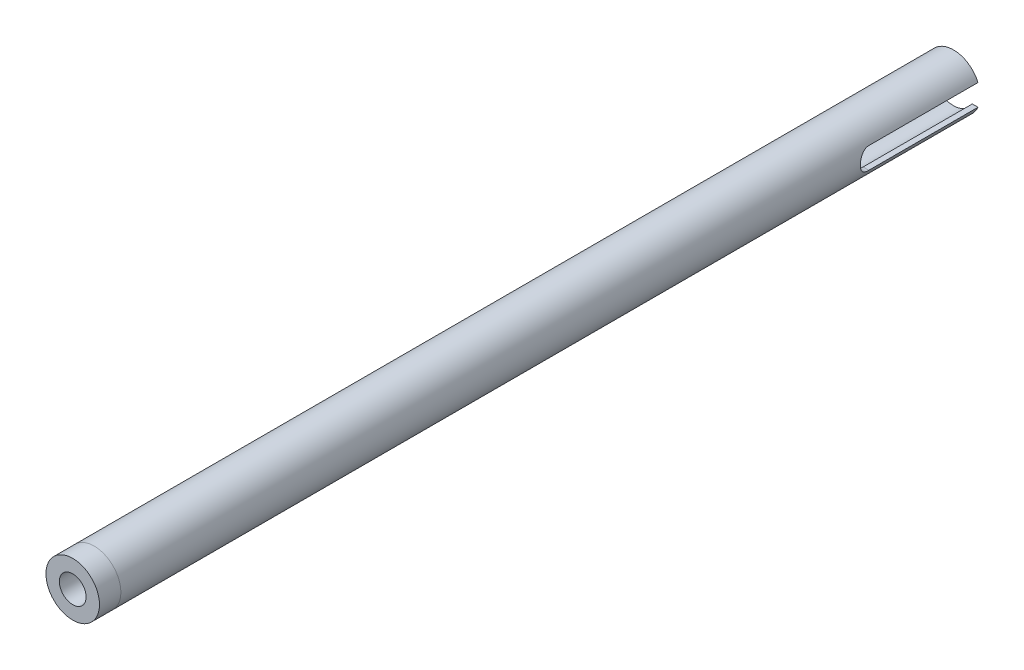
ISO-10303-21;
HEADER;
FILE_DESCRIPTION(('STEP AP214'),'2;1');
FILE_NAME('part.step','',(''),(''),'','','');
FILE_SCHEMA(('AUTOMOTIVE_DESIGN { 1 0 10303 214 1 1 1 1 }'));
ENDSEC;
DATA;
#1=APPLICATION_CONTEXT('core data for automotive mechanical design processes');
#2=APPLICATION_PROTOCOL_DEFINITION('international standard','automotive_design',2000,#1);
#3=PRODUCT_CONTEXT('',#1,'mechanical');
#4=PRODUCT('Part','Part','',(#3));
#5=PRODUCT_RELATED_PRODUCT_CATEGORY('part','',(#4));
#6=PRODUCT_DEFINITION_FORMATION('','',#4);
#7=PRODUCT_DEFINITION_CONTEXT('part definition',#1,'design');
#8=PRODUCT_DEFINITION('design','',#6,#7);
#9=PRODUCT_DEFINITION_SHAPE('','',#8);
#10=(LENGTH_UNIT() NAMED_UNIT(*) SI_UNIT(.MILLI.,.METRE.));
#11=(NAMED_UNIT(*) PLANE_ANGLE_UNIT() SI_UNIT($,.RADIAN.));
#12=(NAMED_UNIT(*) SI_UNIT($,.STERADIAN.) SOLID_ANGLE_UNIT());
#13=UNCERTAINTY_MEASURE_WITH_UNIT(LENGTH_MEASURE(1.E-05),#10,'distance_accuracy_value','');
#14=(GEOMETRIC_REPRESENTATION_CONTEXT(3) GLOBAL_UNCERTAINTY_ASSIGNED_CONTEXT((#13)) GLOBAL_UNIT_ASSIGNED_CONTEXT((#10,
#11,#12)) REPRESENTATION_CONTEXT('',''));
#15=CARTESIAN_POINT('',(0.,0.,0.));
#16=DIRECTION('',(0.,0.,1.));
#17=DIRECTION('',(1.,0.,0.));
#18=AXIS2_PLACEMENT_3D('',#15,#16,#17);
#19=CARTESIAN_POINT('',(0.,0.,-261.290062071358));
#20=DIRECTION('',(0.,0.,1.));
#21=DIRECTION('',(1.,0.,0.));
#22=AXIS2_PLACEMENT_3D('',#19,#20,#21);
#23=CYLINDRICAL_SURFACE('',#22,7.9375);
#24=CARTESIAN_POINT('',(0.,0.,-6.35));
#25=DIRECTION('',(0.,0.,1.));
#26=DIRECTION('',(1.,0.,0.));
#27=AXIS2_PLACEMENT_3D('',#24,#25,#26);
#28=CIRCLE('',#27,7.9375);
#29=CARTESIAN_POINT('',(7.9375,0.,-6.35));
#30=VERTEX_POINT('',#29);
#31=EDGE_CURVE('E167',#30,#30,#28,.T.);
#32=ORIENTED_EDGE('',*,*,#31,.F.);
#33=EDGE_LOOP('',(#32));
#34=FACE_BOUND('',#33,.T.);
#35=CARTESIAN_POINT('',(-7.2748389157424,3.175,-228.905062071358));
#36=CARTESIAN_POINT('',(-7.27482137043434,3.17501267173453,-228.819641955876));
#37=CARTESIAN_POINT('',(-7.27634297592672,3.17155313247793,-228.734231426313));
#38=CARTESIAN_POINT('',(-7.28233338484875,3.15778866907725,-228.564099421985));
#39=CARTESIAN_POINT('',(-7.28680106535325,3.14748635311323,-228.479377697126));
#40=CARTESIAN_POINT('',(-7.29852916312671,3.12019002880163,-228.311563997317));
#41=CARTESIAN_POINT('',(-7.30577831906487,3.10322299732752,-228.228466852558));
#42=CARTESIAN_POINT('',(-7.32282161153745,3.06278779397034,-228.064155750533));
#43=CARTESIAN_POINT('',(-7.33261590324725,3.03931922568673,-227.982941908419));
#44=CARTESIAN_POINT('',(-7.36535331460444,2.9595292434296,-227.743117085837));
#45=CARTESIAN_POINT('',(-7.3916759567784,2.89376893609236,-227.587992157033));
#46=CARTESIAN_POINT('',(-7.45033259991548,2.73920602658921,-227.290904730322));
#47=CARTESIAN_POINT('',(-7.48267254395243,2.65038060922871,-227.148955455104));
#48=CARTESIAN_POINT('',(-7.55175295441386,2.44684429809695,-226.874234685584));
#49=CARTESIAN_POINT('',(-7.58863404630154,2.33103943595689,-226.742307301072));
#50=CARTESIAN_POINT('',(-7.66147718953598,2.07914562663536,-226.49914441744));
#51=CARTESIAN_POINT('',(-7.69743902899202,1.94305205135847,-226.387913652513));
#52=CARTESIAN_POINT('',(-7.76611692840652,1.64778282664418,-226.184992453017));
#53=CARTESIAN_POINT('',(-7.79864638434713,1.48790317306355,-226.094258041614));
#54=CARTESIAN_POINT('',(-7.85502980346525,1.15369615984562,-225.941400488196));
#55=CARTESIAN_POINT('',(-7.87889360585224,0.979385463602713,-225.879244875579));
#56=CARTESIAN_POINT('',(-7.91022225039827,0.670405323433344,-225.798733231923));
#57=CARTESIAN_POINT('',(-7.92038443902171,0.537888188660429,-225.773055308513));
#58=CARTESIAN_POINT('',(-7.93061686811603,0.337231082382099,-225.747300225432));
#59=CARTESIAN_POINT('',(-7.93319257341971,0.269991647180292,-225.740842128151));
#60=CARTESIAN_POINT('',(-7.93663621925193,0.135173873369592,-225.7322211104));
#61=CARTESIAN_POINT('',(-7.93750363389236,0.067595436817584,-225.730059512581));
#62=CARTESIAN_POINT('',(-7.9375,0.,-225.730062071358));
#63=B_SPLINE_CURVE_WITH_KNOTS('',3,(#35,#36,#37,#38,#39,#40,#41,#42,#43,#44,#45,#46,#47,#48,#49,
#50,#51,#52,#53,#54,#55,#56,#57,#58,#59,#60,#61,#62),.UNSPECIFIED.,.F.,.F.,(4,2,2,2,2,2,2,2,2,2,
2,2,2,4),(0.,0.25616079739664,0.512224013007086,0.767261264672294,1.02231406945474,
1.53142416248601,2.041039780479,2.57679273649399,3.11266809162684,3.66991136029743,
4.22651992730647,4.63134321412667,4.83399375866621,5.03670667834028),.UNSPECIFIED.);
#64=CARTESIAN_POINT('',(-7.2748389157424,3.175,-228.905062071358));
#65=VERTEX_POINT('',#64);
#66=CARTESIAN_POINT('',(-7.9375,0.,-225.730062071358));
#67=VERTEX_POINT('',#66);
#68=EDGE_CURVE('E194',#65,#67,#63,.T.);
#69=ORIENTED_EDGE('',*,*,#68,.T.);
#70=CARTESIAN_POINT('',(-7.9375,0.,-225.730062071358));
#71=CARTESIAN_POINT('',(-7.93751279435796,-0.0856973243893168,-225.730050041189));
#72=CARTESIAN_POINT('',(-7.93611246860092,-0.171386675169291,-225.733531408661));
#73=CARTESIAN_POINT('',(-7.93058107051394,-0.342092796869088,-225.747387503996));
#74=CARTESIAN_POINT('',(-7.92645080745519,-0.427109759557718,-225.757760188979));
#75=CARTESIAN_POINT('',(-7.91557399086504,-0.595570690948318,-225.785257383047));
#76=CARTESIAN_POINT('',(-7.90883664469869,-0.679019123580009,-225.80235813432));
#77=CARTESIAN_POINT('',(-7.89293284658536,-0.844038966454647,-225.843125381793));
#78=CARTESIAN_POINT('',(-7.88376629739099,-0.925610301410308,-225.86679214085));
#79=CARTESIAN_POINT('',(-7.8529700783248,-1.16656173687589,-225.947299796548));
#80=CARTESIAN_POINT('',(-7.82802544143957,-1.32244720282991,-226.013692429425));
#81=CARTESIAN_POINT('',(-7.77174407779742,-1.6208190257289,-226.169737833418));
#82=CARTESIAN_POINT('',(-7.74040257287306,-1.76329524966532,-226.259408005482));
#83=CARTESIAN_POINT('',(-7.67287736621953,-2.03755465224645,-226.463861612997));
#84=CARTESIAN_POINT('',(-7.63654472176442,-2.16862853615059,-226.579548469728));
#85=CARTESIAN_POINT('',(-7.56380976030912,-2.41011022612819,-226.830842571437));
#86=CARTESIAN_POINT('',(-7.52740741976911,-2.52050895891189,-226.96645851592));
#87=CARTESIAN_POINT('',(-7.45683282624283,-2.72240939900244,-227.261157010786));
#88=CARTESIAN_POINT('',(-7.42283467350379,-2.81283701743192,-227.421021000702));
#89=CARTESIAN_POINT('',(-7.36333622196319,-2.9651189416839,-227.755146965498));
#90=CARTESIAN_POINT('',(-7.33782422493328,-3.02701262758154,-227.929388703257));
#91=CARTESIAN_POINT('',(-7.30424985403508,-3.10695047193343,-228.237692427908));
#92=CARTESIAN_POINT('',(-7.29331360019112,-3.13238569878911,-228.369551188794));
#93=CARTESIAN_POINT('',(-7.2822797767429,-3.15790858319002,-228.569268070488));
#94=CARTESIAN_POINT('',(-7.27949685702346,-3.16431127275807,-228.636216361248));
#95=CARTESIAN_POINT('',(-7.27577355567174,-3.17285909036155,-228.770457919114));
#96=CARTESIAN_POINT('',(-7.27483380475762,-3.17500276099679,-228.837751296412));
#97=CARTESIAN_POINT('',(-7.2748389157424,-3.175,-228.905062071359));
#98=B_SPLINE_CURVE_WITH_KNOTS('',3,(#70,#71,#72,#73,#74,#75,#76,#77,#78,#79,#80,#81,#82,#83,#84,
#85,#86,#87,#88,#89,#90,#91,#92,#93,#94,#95,#96,#97),.UNSPECIFIED.,.F.,.F.,(4,2,2,2,2,2,2,2,2,2,
2,2,2,4),(0.,0.256996432008008,0.513916713336977,0.769937797705395,1.02596913282158,
1.53722547809955,2.04886511530061,2.58219314099272,3.115754672018,3.67332953074265,
4.23013255190376,4.63306130520187,4.83485003827449,5.03670780985621),.UNSPECIFIED.);
#99=CARTESIAN_POINT('',(-7.2748389157424,-3.175,-228.905062071358));
#100=VERTEX_POINT('',#99);
#101=EDGE_CURVE('E146',#67,#100,#98,.T.);
#102=ORIENTED_EDGE('',*,*,#101,.T.);
#103=DIRECTION('',(0.,0.,-1.));
#104=VECTOR('',#103,1.);
#105=CARTESIAN_POINT('',(-7.2748389157424,-3.175,-225.730062071358));
#106=LINE('',#105,#104);
#107=CARTESIAN_POINT('',(-7.2748389157424,-3.175,-261.290062071358));
#108=VERTEX_POINT('',#107);
#109=EDGE_CURVE('E141',#100,#108,#106,.T.);
#110=ORIENTED_EDGE('',*,*,#109,.T.);
#111=CARTESIAN_POINT('',(0.,0.,-261.290062071358));
#112=DIRECTION('',(0.,0.,1.));
#113=DIRECTION('',(1.,0.,0.));
#114=AXIS2_PLACEMENT_3D('',#111,#112,#113);
#115=CIRCLE('',#114,7.9375);
#116=CARTESIAN_POINT('',(7.2748389157424,-3.175,-261.290062071358));
#117=VERTEX_POINT('',#116);
#118=EDGE_CURVE('E144',#108,#117,#115,.T.);
#119=ORIENTED_EDGE('',*,*,#118,.T.);
#120=DIRECTION('',(0.,0.,-1.));
#121=VECTOR('',#120,1.);
#122=CARTESIAN_POINT('',(7.2748389157424,-3.175,-225.730062071358));
#123=LINE('',#122,#121);
#124=CARTESIAN_POINT('',(7.2748389157424,-3.175,-228.905062071358));
#125=VERTEX_POINT('',#124);
#126=EDGE_CURVE('E427',#125,#117,#123,.T.);
#127=ORIENTED_EDGE('',*,*,#126,.F.);
#128=CARTESIAN_POINT('',(7.2748389157424,-3.175,-228.905062071358));
#129=CARTESIAN_POINT('',(7.27482137043434,-3.17501267173453,-228.819641955876));
#130=CARTESIAN_POINT('',(7.27634297592672,-3.17155313247793,-228.734231426313));
#131=CARTESIAN_POINT('',(7.28233338484875,-3.15778866907725,-228.564099421985));
#132=CARTESIAN_POINT('',(7.28680106535325,-3.14748635311323,-228.479377697126));
#133=CARTESIAN_POINT('',(7.29852916312671,-3.12019002880163,-228.311563997317));
#134=CARTESIAN_POINT('',(7.30577831906487,-3.10322299732752,-228.228466852558));
#135=CARTESIAN_POINT('',(7.32282161153745,-3.06278779397034,-228.064155750533));
#136=CARTESIAN_POINT('',(7.33261590324725,-3.03931922568673,-227.982941908419));
#137=CARTESIAN_POINT('',(7.36535331460444,-2.9595292434296,-227.743117085837));
#138=CARTESIAN_POINT('',(7.3916759567784,-2.89376893609236,-227.587992157033));
#139=CARTESIAN_POINT('',(7.45033259991548,-2.73920602658921,-227.290904730322));
#140=CARTESIAN_POINT('',(7.48267254395243,-2.65038060922871,-227.148955455104));
#141=CARTESIAN_POINT('',(7.55175295441386,-2.44684429809695,-226.874234685584));
#142=CARTESIAN_POINT('',(7.58863404630154,-2.33103943595689,-226.742307301072));
#143=CARTESIAN_POINT('',(7.66147718953598,-2.07914562663536,-226.49914441744));
#144=CARTESIAN_POINT('',(7.69743902899202,-1.94305205135847,-226.387913652513));
#145=CARTESIAN_POINT('',(7.76611692840652,-1.64778282664418,-226.184992453017));
#146=CARTESIAN_POINT('',(7.79864638434713,-1.48790317306355,-226.094258041614));
#147=CARTESIAN_POINT('',(7.85502980346525,-1.15369615984562,-225.941400488196));
#148=CARTESIAN_POINT('',(7.87889360585224,-0.979385463602713,-225.879244875579));
#149=CARTESIAN_POINT('',(7.91022225039827,-0.670405323433344,-225.798733231923));
#150=CARTESIAN_POINT('',(7.92038443902171,-0.537888188660429,-225.773055308513));
#151=CARTESIAN_POINT('',(7.93061686811603,-0.337231082382099,-225.747300225432));
#152=CARTESIAN_POINT('',(7.93319257341971,-0.269991647180292,-225.740842128151));
#153=CARTESIAN_POINT('',(7.93663621925193,-0.135173873369592,-225.7322211104));
#154=CARTESIAN_POINT('',(7.93750363389236,-0.067595436817584,-225.730059512581));
#155=CARTESIAN_POINT('',(7.9375,0.,-225.730062071358));
#156=B_SPLINE_CURVE_WITH_KNOTS('',3,(#128,#129,#130,#131,#132,#133,#134,#135,#136,#137,#138,
#139,#140,#141,#142,#143,#144,#145,#146,#147,#148,#149,#150,#151,#152,#153,#154,#155),
.UNSPECIFIED.,.F.,.F.,(4,2,2,2,2,2,2,2,2,2,2,2,2,4),(0.,0.25616079739664,0.512224013007086,
0.767261264672294,1.02231406945474,1.53142416248601,2.041039780479,2.57679273649399,
3.11266809162684,3.66991136029743,4.22651992730647,4.63134321412667,4.83399375866621,
5.03670667834028),.UNSPECIFIED.);
#157=CARTESIAN_POINT('',(7.9375,0.,-225.730062071358));
#158=VERTEX_POINT('',#157);
#159=EDGE_CURVE('E87',#125,#158,#156,.T.);
#160=ORIENTED_EDGE('',*,*,#159,.T.);
#161=CARTESIAN_POINT('',(7.9375,0.,-225.730062071358));
#162=CARTESIAN_POINT('',(7.93751279435796,0.0856973243893168,-225.730050041189));
#163=CARTESIAN_POINT('',(7.93611246860092,0.171386675169291,-225.733531408661));
#164=CARTESIAN_POINT('',(7.93058107051394,0.342092796869088,-225.747387503996));
#165=CARTESIAN_POINT('',(7.92645080745519,0.427109759557718,-225.757760188979));
#166=CARTESIAN_POINT('',(7.91557399086504,0.595570690948318,-225.785257383047));
#167=CARTESIAN_POINT('',(7.90883664469869,0.679019123580009,-225.80235813432));
#168=CARTESIAN_POINT('',(7.89293284658536,0.844038966454647,-225.843125381793));
#169=CARTESIAN_POINT('',(7.88376629739099,0.925610301410308,-225.86679214085));
#170=CARTESIAN_POINT('',(7.8529700783248,1.16656173687589,-225.947299796548));
#171=CARTESIAN_POINT('',(7.82802544143957,1.32244720282991,-226.013692429425));
#172=CARTESIAN_POINT('',(7.77174407779742,1.6208190257289,-226.169737833418));
#173=CARTESIAN_POINT('',(7.74040257287306,1.76329524966532,-226.259408005482));
#174=CARTESIAN_POINT('',(7.67287736621953,2.03755465224645,-226.463861612997));
#175=CARTESIAN_POINT('',(7.63654472176442,2.16862853615059,-226.579548469728));
#176=CARTESIAN_POINT('',(7.56380976030912,2.41011022612819,-226.830842571437));
#177=CARTESIAN_POINT('',(7.52740741976911,2.52050895891189,-226.96645851592));
#178=CARTESIAN_POINT('',(7.45683282624283,2.72240939900244,-227.261157010786));
#179=CARTESIAN_POINT('',(7.42283467350379,2.81283701743192,-227.421021000702));
#180=CARTESIAN_POINT('',(7.36333622196319,2.9651189416839,-227.755146965498));
#181=CARTESIAN_POINT('',(7.33782422493328,3.02701262758154,-227.929388703257));
#182=CARTESIAN_POINT('',(7.30424985403508,3.10695047193343,-228.237692427908));
#183=CARTESIAN_POINT('',(7.29331360019112,3.13238569878911,-228.369551188794));
#184=CARTESIAN_POINT('',(7.2822797767429,3.15790858319002,-228.569268070488));
#185=CARTESIAN_POINT('',(7.27949685702346,3.16431127275807,-228.636216361248));
#186=CARTESIAN_POINT('',(7.27577355567174,3.17285909036155,-228.770457919114));
#187=CARTESIAN_POINT('',(7.27483380475762,3.17500276099679,-228.837751296412));
#188=CARTESIAN_POINT('',(7.2748389157424,3.175,-228.905062071359));
#189=B_SPLINE_CURVE_WITH_KNOTS('',3,(#161,#162,#163,#164,#165,#166,#167,#168,#169,#170,#171,
#172,#173,#174,#175,#176,#177,#178,#179,#180,#181,#182,#183,#184,#185,#186,#187,#188),
.UNSPECIFIED.,.F.,.F.,(4,2,2,2,2,2,2,2,2,2,2,2,2,4),(0.,0.256996432008008,0.513916713336977,
0.769937797705395,1.02596913282158,1.53722547809955,2.04886511530061,2.58219314099272,
3.115754672018,3.67332953074265,4.23013255190376,4.63306130520187,4.83485003827449,
5.03670780985621),.UNSPECIFIED.);
#190=CARTESIAN_POINT('',(7.2748389157424,3.175,-228.905062071358));
#191=VERTEX_POINT('',#190);
#192=EDGE_CURVE('E73',#158,#191,#189,.T.);
#193=ORIENTED_EDGE('',*,*,#192,.T.);
#194=DIRECTION('',(0.,0.,-1.));
#195=VECTOR('',#194,1.);
#196=CARTESIAN_POINT('',(7.2748389157424,3.175,-225.730062071358));
#197=LINE('',#196,#195);
#198=CARTESIAN_POINT('',(7.2748389157424,3.175,-261.290062071358));
#199=VERTEX_POINT('',#198);
#200=EDGE_CURVE('E160',#191,#199,#197,.T.);
#201=ORIENTED_EDGE('',*,*,#200,.T.);
#202=CARTESIAN_POINT('',(-7.2748389157424,3.175,-261.290062071358));
#203=VERTEX_POINT('',#202);
#204=EDGE_CURVE('E166',#199,#203,#115,.T.);
#205=ORIENTED_EDGE('',*,*,#204,.T.);
#206=DIRECTION('',(0.,0.,-1.));
#207=VECTOR('',#206,1.);
#208=CARTESIAN_POINT('',(-7.2748389157424,3.175,-225.730062071358));
#209=LINE('',#208,#207);
#210=EDGE_CURVE('E420',#65,#203,#209,.T.);
#211=ORIENTED_EDGE('',*,*,#210,.F.);
#212=EDGE_LOOP('',(#69,#102,#110,#119,#127,#160,#193,#201,#205,#211));
#213=FACE_BOUND('',#212,.T.);
#214=ADVANCED_FACE('F63',(#34,#213),#23,.T.);
#215=CARTESIAN_POINT('',(0.,0.,-261.290062071358));
#216=DIRECTION('',(0.,0.,1.));
#217=DIRECTION('',(1.,0.,0.));
#218=AXIS2_PLACEMENT_3D('',#215,#216,#217);
#219=PLANE('',#218);
#220=DIRECTION('',(1.,0.,0.));
#221=VECTOR('',#220,1.);
#222=CARTESIAN_POINT('',(0.,-3.175,-261.290062071358));
#223=LINE('',#222,#221);
#224=CARTESIAN_POINT('',(-5.57246419907746,-3.175,-261.290062071358));
#225=VERTEX_POINT('',#224);
#226=EDGE_CURVE('E153',#108,#225,#223,.T.);
#227=ORIENTED_EDGE('',*,*,#226,.T.);
#228=CARTESIAN_POINT('',(0.,0.,-261.290062071358));
#229=DIRECTION('',(0.,0.,1.));
#230=DIRECTION('',(1.,0.,0.));
#231=AXIS2_PLACEMENT_3D('',#228,#229,#230);
#232=CIRCLE('',#231,6.4135);
#233=CARTESIAN_POINT('',(5.57246419907746,-3.175,-261.290062071358));
#234=VERTEX_POINT('',#233);
#235=EDGE_CURVE('E275',#225,#234,#232,.T.);
#236=ORIENTED_EDGE('',*,*,#235,.T.);
#237=DIRECTION('',(1.,0.,0.));
#238=VECTOR('',#237,1.);
#239=CARTESIAN_POINT('',(0.,-3.175,-261.290062071358));
#240=LINE('',#239,#238);
#241=EDGE_CURVE('E165',#234,#117,#240,.T.);
#242=ORIENTED_EDGE('',*,*,#241,.T.);
#243=ORIENTED_EDGE('',*,*,#118,.F.);
#244=EDGE_LOOP('',(#227,#236,#242,#243));
#245=FACE_BOUND('',#244,.T.);
#246=ADVANCED_FACE('F163',(#245),#219,.F.);
#247=CARTESIAN_POINT('',(0.,0.,-261.290062071358));
#248=DIRECTION('',(0.,0.,1.));
#249=DIRECTION('',(1.,0.,0.));
#250=AXIS2_PLACEMENT_3D('',#247,#248,#249);
#251=CYLINDRICAL_SURFACE('',#250,6.4135);
#252=CARTESIAN_POINT('',(0.,0.,-6.35));
#253=DIRECTION('',(0.,0.,1.));
#254=DIRECTION('',(1.,0.,0.));
#255=AXIS2_PLACEMENT_3D('',#252,#253,#254);
#256=CIRCLE('',#255,6.4135);
#257=CARTESIAN_POINT('',(6.4135,0.,-6.35));
#258=VERTEX_POINT('',#257);
#259=EDGE_CURVE('E149',#258,#258,#256,.T.);
#260=ORIENTED_EDGE('',*,*,#259,.T.);
#261=EDGE_LOOP('',(#260));
#262=FACE_BOUND('',#261,.T.);
#263=DIRECTION('',(0.,0.,-1.));
#264=VECTOR('',#263,1.);
#265=CARTESIAN_POINT('',(-5.57246419907746,-3.175,-225.730062071358));
#266=LINE('',#265,#264);
#267=CARTESIAN_POINT('',(-5.57246419907746,-3.175,-228.905062071358));
#268=VERTEX_POINT('',#267);
#269=EDGE_CURVE('E150',#268,#225,#266,.T.);
#270=ORIENTED_EDGE('',*,*,#269,.F.);
#271=CARTESIAN_POINT('',(-5.57246419907746,-3.175,-228.905062071358));
#272=CARTESIAN_POINT('',(-5.57244013006406,-3.17501485930532,-228.82178295832));
#273=CARTESIAN_POINT('',(-5.57433046393328,-3.17172393593588,-228.738517191449));
#274=CARTESIAN_POINT('',(-5.58175879139226,-3.1586474174694,-228.572709606638));
#275=CARTESIAN_POINT('',(-5.58729459414878,-3.14886572313218,-228.490167384036));
#276=CARTESIAN_POINT('',(-5.60179156831921,-3.12299843383607,-228.326870577307));
#277=CARTESIAN_POINT('',(-5.61073298145,-3.10694918790096,-228.246108472394));
#278=CARTESIAN_POINT('',(-5.63171276239417,-3.068756659135,-228.086464556893));
#279=CARTESIAN_POINT('',(-5.64375147558632,-3.04661269666536,-228.007582957072));
#280=CARTESIAN_POINT('',(-5.6838799338154,-2.97148657354666,-227.774849782074));
#281=CARTESIAN_POINT('',(-5.71602843451585,-2.9097324304215,-227.624429284835));
#282=CARTESIAN_POINT('',(-5.78746445334563,-2.76491119647658,-227.335972068007));
#283=CARTESIAN_POINT('',(-5.82676307252431,-2.68181088046088,-227.197955110641));
#284=CARTESIAN_POINT('',(-5.91189137020973,-2.48887418737119,-226.926158026613));
#285=CARTESIAN_POINT('',(-5.95799203211626,-2.37743022169017,-226.793601224162));
#286=CARTESIAN_POINT('',(-6.04933625068999,-2.13433179626949,-226.548133555089));
#287=CARTESIAN_POINT('',(-6.09457954365872,-2.00267122837296,-226.435228648076));
#288=CARTESIAN_POINT('',(-6.18270630442022,-1.71220053093682,-226.224909355624));
#289=CARTESIAN_POINT('',(-6.22523407848511,-1.55216870534976,-226.129019605193));
#290=CARTESIAN_POINT('',(-6.29953728626817,-1.21586879246633,-225.966170708875));
#291=CARTESIAN_POINT('',(-6.33132906884324,-1.03962591706377,-225.899167530833));
#292=CARTESIAN_POINT('',(-6.37455801221378,-0.71941894247625,-225.809295698502));
#293=CARTESIAN_POINT('',(-6.38903678436651,-0.577736145507954,-225.779722984137));
#294=CARTESIAN_POINT('',(-6.40364692368403,-0.362616983152033,-225.750001909823));
#295=CARTESIAN_POINT('',(-6.40733246196224,-0.290370591494073,-225.742534397185));
#296=CARTESIAN_POINT('',(-6.41226237468065,-0.145424356491902,-225.732561508247));
#297=CARTESIAN_POINT('',(-6.41350576158006,-0.0727243416303689,-225.73005813931));
#298=CARTESIAN_POINT('',(-6.4135,0.,-225.730062071358));
#299=B_SPLINE_CURVE_WITH_KNOTS('',3,(#271,#272,#273,#274,#275,#276,#277,#278,#279,#280,#281,
#282,#283,#284,#285,#286,#287,#288,#289,#290,#291,#292,#293,#294,#295,#296,#297,#298),
.UNSPECIFIED.,.F.,.F.,(4,2,2,2,2,2,2,2,2,2,2,2,2,4),(0.,0.249729002226553,0.499308060527525,
0.74746066754666,0.995640957972498,1.49055300136661,1.98624009021396,2.52160227908799,
3.05712653941521,3.62817923327587,4.19835836008503,4.63305000595098,4.85103401853339,
5.06910615989468),.UNSPECIFIED.);
#300=CARTESIAN_POINT('',(-6.4135,0.,-225.730062071358));
#301=VERTEX_POINT('',#300);
#302=EDGE_CURVE('E221',#268,#301,#299,.T.);
#303=ORIENTED_EDGE('',*,*,#302,.T.);
#304=CARTESIAN_POINT('',(-6.4135,0.,-225.730062071358));
#305=CARTESIAN_POINT('',(-6.41351478956105,0.0839162873638157,-225.730048671462));
#306=CARTESIAN_POINT('',(-6.41185341043851,0.167823114288178,-225.733388597509));
#307=CARTESIAN_POINT('',(-6.40528923860734,0.334952536326366,-225.746671038114));
#308=CARTESIAN_POINT('',(-6.40038773102953,0.418175389480088,-225.756610934935));
#309=CARTESIAN_POINT('',(-6.38748331817869,0.582965498785218,-225.782929739453));
#310=CARTESIAN_POINT('',(-6.37949454331383,0.664538541389252,-225.799279314941));
#311=CARTESIAN_POINT('',(-6.36062930478242,0.825821595252369,-225.838217618535));
#312=CARTESIAN_POINT('',(-6.34975266552956,0.905531492908814,-225.860806726016));
#313=CARTESIAN_POINT('',(-6.31319792977548,1.14087800407252,-225.937543288775));
#314=CARTESIAN_POINT('',(-6.28356695572382,1.29306927815056,-226.000714936963));
#315=CARTESIAN_POINT('',(-6.216480326228,1.58455945770356,-226.148865678943));
#316=CARTESIAN_POINT('',(-6.17901685649498,1.72384528592311,-226.233866570723));
#317=CARTESIAN_POINT('',(-6.09713913910646,1.99475482128858,-226.428966708974));
#318=CARTESIAN_POINT('',(-6.05244508581476,2.12544046453043,-226.540251585713));
#319=CARTESIAN_POINT('',(-5.96206469267669,2.36716277188881,-226.782221031878));
#320=CARTESIAN_POINT('',(-5.91637760323869,2.47818397002904,-226.912920723717));
#321=CARTESIAN_POINT('',(-5.82517699615971,2.68591268931948,-227.201966552669));
#322=CARTESIAN_POINT('',(-5.77994318763785,2.78087960507694,-227.36166174725));
#323=CARTESIAN_POINT('',(-5.69959190124919,2.94207442790849,-227.697045024431));
#324=CARTESIAN_POINT('',(-5.66445328320705,3.00836254036258,-227.872698657603));
#325=CARTESIAN_POINT('',(-5.61637168534323,3.09697219420915,-228.191150031996));
#326=CARTESIAN_POINT('',(-5.60011055849822,3.1260622343607,-228.331564634656));
#327=CARTESIAN_POINT('',(-5.58363385282995,3.15533369889112,-228.544941512899));
#328=CARTESIAN_POINT('',(-5.57946041232981,3.16269716900745,-228.61667323778));
#329=CARTESIAN_POINT('',(-5.57386984218861,3.17253394278506,-228.760615177823));
#330=CARTESIAN_POINT('',(-5.57245416126573,3.17500467618403,-228.832825624494));
#331=CARTESIAN_POINT('',(-5.57246419907746,3.175,-228.905062071358));
#332=B_SPLINE_CURVE_WITH_KNOTS('',3,(#304,#305,#306,#307,#308,#309,#310,#311,#312,#313,#314,
#315,#316,#317,#318,#319,#320,#321,#322,#323,#324,#325,#326,#327,#328,#329,#330,#331),
.UNSPECIFIED.,.F.,.F.,(4,2,2,2,2,2,2,2,2,2,2,2,2,4),(0.,0.251650249697325,0.50320074729884,
0.753613280993143,1.00404104361823,1.50387930503277,2.00421864304454,2.53410176460239,
3.06439980342594,3.63519589642624,4.20478783377489,4.63602373673191,4.85251353275901,
5.06911702550462),.UNSPECIFIED.);
#333=CARTESIAN_POINT('',(-5.57246419907746,3.175,-228.905062071358));
#334=VERTEX_POINT('',#333);
#335=EDGE_CURVE('E186',#301,#334,#332,.T.);
#336=ORIENTED_EDGE('',*,*,#335,.T.);
#337=DIRECTION('',(0.,0.,-1.));
#338=VECTOR('',#337,1.);
#339=CARTESIAN_POINT('',(-5.57246419907746,3.175,-225.730062071358));
#340=LINE('',#339,#338);
#341=CARTESIAN_POINT('',(-5.57246419907746,3.175,-261.290062071358));
#342=VERTEX_POINT('',#341);
#343=EDGE_CURVE('E417',#334,#342,#340,.T.);
#344=ORIENTED_EDGE('',*,*,#343,.T.);
#345=CARTESIAN_POINT('',(5.57246419907746,3.175,-261.290062071358));
#346=VERTEX_POINT('',#345);
#347=EDGE_CURVE('E172',#346,#342,#232,.T.);
#348=ORIENTED_EDGE('',*,*,#347,.F.);
#349=DIRECTION('',(0.,0.,-1.));
#350=VECTOR('',#349,1.);
#351=CARTESIAN_POINT('',(5.57246419907746,3.175,-225.730062071358));
#352=LINE('',#351,#350);
#353=CARTESIAN_POINT('',(5.57246419907746,3.175,-228.905062071358));
#354=VERTEX_POINT('',#353);
#355=EDGE_CURVE('E269',#354,#346,#352,.T.);
#356=ORIENTED_EDGE('',*,*,#355,.F.);
#357=CARTESIAN_POINT('',(5.57246419907746,3.175,-228.905062071358));
#358=CARTESIAN_POINT('',(5.57244013006406,3.17501485930532,-228.82178295832));
#359=CARTESIAN_POINT('',(5.57433046393328,3.17172393593588,-228.738517191449));
#360=CARTESIAN_POINT('',(5.58175879139226,3.1586474174694,-228.572709606638));
#361=CARTESIAN_POINT('',(5.58729459414878,3.14886572313218,-228.490167384036));
#362=CARTESIAN_POINT('',(5.60179156831921,3.12299843383607,-228.326870577307));
#363=CARTESIAN_POINT('',(5.61073298145,3.10694918790096,-228.246108472394));
#364=CARTESIAN_POINT('',(5.63171276239417,3.068756659135,-228.086464556893));
#365=CARTESIAN_POINT('',(5.64375147558632,3.04661269666536,-228.007582957072));
#366=CARTESIAN_POINT('',(5.6838799338154,2.97148657354666,-227.774849782074));
#367=CARTESIAN_POINT('',(5.71602843451585,2.9097324304215,-227.624429284835));
#368=CARTESIAN_POINT('',(5.78746445334563,2.76491119647658,-227.335972068007));
#369=CARTESIAN_POINT('',(5.82676307252431,2.68181088046088,-227.197955110641));
#370=CARTESIAN_POINT('',(5.91189137020973,2.48887418737119,-226.926158026613));
#371=CARTESIAN_POINT('',(5.95799203211626,2.37743022169017,-226.793601224162));
#372=CARTESIAN_POINT('',(6.04933625068999,2.13433179626949,-226.548133555089));
#373=CARTESIAN_POINT('',(6.09457954365872,2.00267122837296,-226.435228648076));
#374=CARTESIAN_POINT('',(6.18270630442022,1.71220053093682,-226.224909355624));
#375=CARTESIAN_POINT('',(6.22523407848511,1.55216870534976,-226.129019605193));
#376=CARTESIAN_POINT('',(6.29953728626817,1.21586879246633,-225.966170708875));
#377=CARTESIAN_POINT('',(6.33132906884324,1.03962591706377,-225.899167530833));
#378=CARTESIAN_POINT('',(6.37455801221378,0.71941894247625,-225.809295698502));
#379=CARTESIAN_POINT('',(6.38903678436651,0.577736145507954,-225.779722984137));
#380=CARTESIAN_POINT('',(6.40364692368403,0.362616983152033,-225.750001909823));
#381=CARTESIAN_POINT('',(6.40733246196224,0.290370591494073,-225.742534397185));
#382=CARTESIAN_POINT('',(6.41226237468065,0.145424356491902,-225.732561508247));
#383=CARTESIAN_POINT('',(6.41350576158006,0.0727243416303689,-225.73005813931));
#384=CARTESIAN_POINT('',(6.4135,0.,-225.730062071358));
#385=B_SPLINE_CURVE_WITH_KNOTS('',3,(#357,#358,#359,#360,#361,#362,#363,#364,#365,#366,#367,
#368,#369,#370,#371,#372,#373,#374,#375,#376,#377,#378,#379,#380,#381,#382,#383,#384),
.UNSPECIFIED.,.F.,.F.,(4,2,2,2,2,2,2,2,2,2,2,2,2,4),(0.,0.249729002226553,0.499308060527525,
0.74746066754666,0.995640957972498,1.49055300136661,1.98624009021396,2.52160227908799,
3.05712653941521,3.62817923327587,4.19835836008503,4.63305000595098,4.85103401853339,
5.06910615989468),.UNSPECIFIED.);
#386=CARTESIAN_POINT('',(6.4135,0.,-225.730062071358));
#387=VERTEX_POINT('',#386);
#388=EDGE_CURVE('E13',#354,#387,#385,.T.);
#389=ORIENTED_EDGE('',*,*,#388,.T.);
#390=CARTESIAN_POINT('',(6.4135,0.,-225.730062071358));
#391=CARTESIAN_POINT('',(6.41351478956105,-0.0839162873638157,-225.730048671462));
#392=CARTESIAN_POINT('',(6.41185341043851,-0.167823114288178,-225.733388597509));
#393=CARTESIAN_POINT('',(6.40528923860734,-0.334952536326366,-225.746671038114));
#394=CARTESIAN_POINT('',(6.40038773102953,-0.418175389480088,-225.756610934935));
#395=CARTESIAN_POINT('',(6.38748331817869,-0.582965498785218,-225.782929739453));
#396=CARTESIAN_POINT('',(6.37949454331383,-0.664538541389252,-225.799279314941));
#397=CARTESIAN_POINT('',(6.36062930478242,-0.825821595252369,-225.838217618535));
#398=CARTESIAN_POINT('',(6.34975266552956,-0.905531492908814,-225.860806726016));
#399=CARTESIAN_POINT('',(6.31319792977548,-1.14087800407252,-225.937543288775));
#400=CARTESIAN_POINT('',(6.28356695572382,-1.29306927815056,-226.000714936963));
#401=CARTESIAN_POINT('',(6.216480326228,-1.58455945770356,-226.148865678943));
#402=CARTESIAN_POINT('',(6.17901685649498,-1.72384528592311,-226.233866570723));
#403=CARTESIAN_POINT('',(6.09713913910646,-1.99475482128858,-226.428966708974));
#404=CARTESIAN_POINT('',(6.05244508581476,-2.12544046453043,-226.540251585713));
#405=CARTESIAN_POINT('',(5.96206469267669,-2.36716277188881,-226.782221031878));
#406=CARTESIAN_POINT('',(5.91637760323869,-2.47818397002904,-226.912920723717));
#407=CARTESIAN_POINT('',(5.82517699615971,-2.68591268931948,-227.201966552669));
#408=CARTESIAN_POINT('',(5.77994318763785,-2.78087960507694,-227.36166174725));
#409=CARTESIAN_POINT('',(5.69959190124919,-2.94207442790849,-227.697045024431));
#410=CARTESIAN_POINT('',(5.66445328320705,-3.00836254036258,-227.872698657603));
#411=CARTESIAN_POINT('',(5.61637168534323,-3.09697219420915,-228.191150031996));
#412=CARTESIAN_POINT('',(5.60011055849822,-3.1260622343607,-228.331564634656));
#413=CARTESIAN_POINT('',(5.58363385282995,-3.15533369889112,-228.544941512899));
#414=CARTESIAN_POINT('',(5.57946041232981,-3.16269716900745,-228.61667323778));
#415=CARTESIAN_POINT('',(5.57386984218861,-3.17253394278506,-228.760615177823));
#416=CARTESIAN_POINT('',(5.57245416126573,-3.17500467618403,-228.832825624494));
#417=CARTESIAN_POINT('',(5.57246419907746,-3.175,-228.905062071358));
#418=B_SPLINE_CURVE_WITH_KNOTS('',3,(#390,#391,#392,#393,#394,#395,#396,#397,#398,#399,#400,
#401,#402,#403,#404,#405,#406,#407,#408,#409,#410,#411,#412,#413,#414,#415,#416,#417),
.UNSPECIFIED.,.F.,.F.,(4,2,2,2,2,2,2,2,2,2,2,2,2,4),(0.,0.251650249697325,0.50320074729884,
0.753613280993143,1.00404104361823,1.50387930503277,2.00421864304454,2.53410176460239,
3.06439980342594,3.63519589642624,4.20478783377489,4.63602373673191,4.85251353275901,
5.06911702550462),.UNSPECIFIED.);
#419=CARTESIAN_POINT('',(5.57246419907746,-3.175,-228.905062071358));
#420=VERTEX_POINT('',#419);
#421=EDGE_CURVE('E237',#387,#420,#418,.T.);
#422=ORIENTED_EDGE('',*,*,#421,.T.);
#423=DIRECTION('',(0.,0.,-1.));
#424=VECTOR('',#423,1.);
#425=CARTESIAN_POINT('',(5.57246419907746,-3.175,-225.730062071358));
#426=LINE('',#425,#424);
#427=EDGE_CURVE('E271',#420,#234,#426,.T.);
#428=ORIENTED_EDGE('',*,*,#427,.T.);
#429=ORIENTED_EDGE('',*,*,#235,.F.);
#430=EDGE_LOOP('',(#270,#303,#336,#344,#348,#356,#389,#422,#428,#429));
#431=FACE_BOUND('',#430,.T.);
#432=ADVANCED_FACE('F201',(#262,#431),#251,.F.);
#433=ORIENTED_EDGE('',*,*,#347,.T.);
#434=DIRECTION('',(1.,0.,0.));
#435=VECTOR('',#434,1.);
#436=CARTESIAN_POINT('',(0.,3.175,-261.290062071358));
#437=LINE('',#436,#435);
#438=EDGE_CURVE('E159',#203,#342,#437,.T.);
#439=ORIENTED_EDGE('',*,*,#438,.F.);
#440=ORIENTED_EDGE('',*,*,#204,.F.);
#441=DIRECTION('',(1.,0.,0.));
#442=VECTOR('',#441,1.);
#443=CARTESIAN_POINT('',(0.,3.175,-261.290062071358));
#444=LINE('',#443,#442);
#445=EDGE_CURVE('E253',#346,#199,#444,.T.);
#446=ORIENTED_EDGE('',*,*,#445,.F.);
#447=EDGE_LOOP('',(#433,#439,#440,#446));
#448=FACE_BOUND('',#447,.T.);
#449=ADVANCED_FACE('F286',(#448),#219,.F.);
#450=CARTESIAN_POINT('',(0.,0.,-6.35));
#451=DIRECTION('',(0.,0.,1.));
#452=DIRECTION('',(1.,0.,0.));
#453=AXIS2_PLACEMENT_3D('',#450,#451,#452);
#454=PLANE('',#453);
#455=ORIENTED_EDGE('',*,*,#259,.F.);
#456=EDGE_LOOP('',(#455));
#457=FACE_BOUND('',#456,.T.);
#458=ORIENTED_EDGE('',*,*,#31,.T.);
#459=EDGE_LOOP('',(#458));
#460=FACE_BOUND('',#459,.T.);
#461=ADVANCED_FACE('F283',(#457,#460),#454,.T.);
#462=CARTESIAN_POINT('',(0.,3.175,-225.730062071358));
#463=DIRECTION('',(0.,1.,0.));
#464=DIRECTION('',(0.,0.,1.));
#465=AXIS2_PLACEMENT_3D('',#462,#463,#464);
#466=PLANE('',#465);
#467=ORIENTED_EDGE('',*,*,#200,.F.);
#468=DIRECTION('',(1.,0.,0.));
#469=VECTOR('',#468,1.);
#470=CARTESIAN_POINT('',(5.57246419907746,3.175,-228.905062071358));
#471=LINE('',#470,#469);
#472=EDGE_CURVE('E184',#191,#354,#471,.F.);
#473=ORIENTED_EDGE('',*,*,#472,.T.);
#474=ORIENTED_EDGE('',*,*,#355,.T.);
#475=ORIENTED_EDGE('',*,*,#445,.T.);
#476=EDGE_LOOP('',(#467,#473,#474,#475));
#477=FACE_BOUND('',#476,.T.);
#478=ADVANCED_FACE('F266',(#477),#466,.F.);
#479=CARTESIAN_POINT('',(0.,-3.175,-225.730062071358));
#480=DIRECTION('',(0.,1.,0.));
#481=DIRECTION('',(0.,0.,1.));
#482=AXIS2_PLACEMENT_3D('',#479,#480,#481);
#483=PLANE('',#482);
#484=ORIENTED_EDGE('',*,*,#427,.F.);
#485=DIRECTION('',(1.,0.,0.));
#486=VECTOR('',#485,1.);
#487=CARTESIAN_POINT('',(0.,-3.175,-228.905062071358));
#488=LINE('',#487,#486);
#489=EDGE_CURVE('E181',#420,#125,#488,.T.);
#490=ORIENTED_EDGE('',*,*,#489,.T.);
#491=ORIENTED_EDGE('',*,*,#126,.T.);
#492=ORIENTED_EDGE('',*,*,#241,.F.);
#493=EDGE_LOOP('',(#484,#490,#491,#492));
#494=FACE_BOUND('',#493,.T.);
#495=ADVANCED_FACE('F361',(#494),#483,.T.);
#496=CARTESIAN_POINT('',(0.,-3.175,-225.730062071358));
#497=DIRECTION('',(0.,1.,0.));
#498=DIRECTION('',(0.,0.,1.));
#499=AXIS2_PLACEMENT_3D('',#496,#497,#498);
#500=PLANE('',#499);
#501=ORIENTED_EDGE('',*,*,#109,.F.);
#502=DIRECTION('',(1.,0.,0.));
#503=VECTOR('',#502,1.);
#504=CARTESIAN_POINT('',(0.,-3.175,-228.905062071358));
#505=LINE('',#504,#503);
#506=EDGE_CURVE('E179',#100,#268,#505,.T.);
#507=ORIENTED_EDGE('',*,*,#506,.T.);
#508=ORIENTED_EDGE('',*,*,#269,.T.);
#509=ORIENTED_EDGE('',*,*,#226,.F.);
#510=EDGE_LOOP('',(#501,#507,#508,#509));
#511=FACE_BOUND('',#510,.T.);
#512=ADVANCED_FACE('F154',(#511),#500,.T.);
#513=CARTESIAN_POINT('',(0.,3.175,-225.730062071358));
#514=DIRECTION('',(0.,1.,0.));
#515=DIRECTION('',(0.,0.,1.));
#516=AXIS2_PLACEMENT_3D('',#513,#514,#515);
#517=PLANE('',#516);
#518=ORIENTED_EDGE('',*,*,#343,.F.);
#519=DIRECTION('',(1.,0.,0.));
#520=VECTOR('',#519,1.);
#521=CARTESIAN_POINT('',(-7.2748389157424,3.175,-228.905062071358));
#522=LINE('',#521,#520);
#523=EDGE_CURVE('E170',#334,#65,#522,.F.);
#524=ORIENTED_EDGE('',*,*,#523,.T.);
#525=ORIENTED_EDGE('',*,*,#210,.T.);
#526=ORIENTED_EDGE('',*,*,#438,.T.);
#527=EDGE_LOOP('',(#518,#524,#525,#526));
#528=FACE_BOUND('',#527,.T.);
#529=ADVANCED_FACE('F216',(#528),#517,.F.);
#530=CARTESIAN_POINT('',(0.,0.,-228.905062071358));
#531=DIRECTION('',(1.,0.,0.));
#532=DIRECTION('',(0.,0.,-1.));
#533=AXIS2_PLACEMENT_3D('',#530,#531,#532);
#534=CYLINDRICAL_SURFACE('',#533,3.175);
#535=ORIENTED_EDGE('',*,*,#506,.F.);
#536=ORIENTED_EDGE('',*,*,#101,.F.);
#537=DIRECTION('',(1.,0.,0.));
#538=VECTOR('',#537,1.);
#539=CARTESIAN_POINT('',(0.,0.,-225.730062071358));
#540=LINE('',#539,#538);
#541=EDGE_CURVE('E251',#301,#67,#540,.F.);
#542=ORIENTED_EDGE('',*,*,#541,.F.);
#543=ORIENTED_EDGE('',*,*,#302,.F.);
#544=EDGE_LOOP('',(#535,#536,#542,#543));
#545=FACE_BOUND('',#544,.T.);
#546=ADVANCED_FACE('F209',(#545),#534,.F.);
#547=CARTESIAN_POINT('',(0.,0.,-228.905062071358));
#548=DIRECTION('',(-1.,0.,0.));
#549=DIRECTION('',(0.,0.,1.));
#550=AXIS2_PLACEMENT_3D('',#547,#548,#549);
#551=CYLINDRICAL_SURFACE('',#550,3.175);
#552=ORIENTED_EDGE('',*,*,#68,.F.);
#553=ORIENTED_EDGE('',*,*,#523,.F.);
#554=ORIENTED_EDGE('',*,*,#335,.F.);
#555=ORIENTED_EDGE('',*,*,#541,.T.);
#556=EDGE_LOOP('',(#552,#553,#554,#555));
#557=FACE_BOUND('',#556,.T.);
#558=ADVANCED_FACE('F205',(#557),#551,.F.);
#559=CARTESIAN_POINT('',(0.,0.,-228.905062071358));
#560=DIRECTION('',(-1.,0.,0.));
#561=DIRECTION('',(0.,0.,1.));
#562=AXIS2_PLACEMENT_3D('',#559,#560,#561);
#563=CYLINDRICAL_SURFACE('',#562,3.175);
#564=DIRECTION('',(1.,0.,0.));
#565=VECTOR('',#564,1.);
#566=CARTESIAN_POINT('',(7.2748389157424,0.,-225.730062071358));
#567=LINE('',#566,#565);
#568=EDGE_CURVE('E68',#387,#158,#567,.T.);
#569=ORIENTED_EDGE('',*,*,#568,.F.);
#570=ORIENTED_EDGE('',*,*,#388,.F.);
#571=ORIENTED_EDGE('',*,*,#472,.F.);
#572=ORIENTED_EDGE('',*,*,#192,.F.);
#573=EDGE_LOOP('',(#569,#570,#571,#572));
#574=FACE_BOUND('',#573,.T.);
#575=ADVANCED_FACE('F65',(#574),#563,.F.);
#576=CARTESIAN_POINT('',(0.,0.,-228.905062071358));
#577=DIRECTION('',(1.,0.,0.));
#578=DIRECTION('',(0.,0.,-1.));
#579=AXIS2_PLACEMENT_3D('',#576,#577,#578);
#580=CYLINDRICAL_SURFACE('',#579,3.175);
#581=ORIENTED_EDGE('',*,*,#421,.F.);
#582=ORIENTED_EDGE('',*,*,#568,.T.);
#583=ORIENTED_EDGE('',*,*,#159,.F.);
#584=ORIENTED_EDGE('',*,*,#489,.F.);
#585=EDGE_LOOP('',(#581,#582,#583,#584));
#586=FACE_BOUND('',#585,.T.);
#587=ADVANCED_FACE('F218',(#586),#580,.F.);
#588=CLOSED_SHELL('',(#214,#246,#432,#449,#461,#478,#495,#512,#529,#546,#558,#575,#587));
#589=MANIFOLD_SOLID_BREP('B2',#588);
#590=CARTESIAN_POINT('',(0.,0.,-6.35));
#591=DIRECTION('',(0.,0.,1.));
#592=DIRECTION('',(1.,0.,0.));
#593=AXIS2_PLACEMENT_3D('',#590,#591,#592);
#594=CYLINDRICAL_SURFACE('',#593,7.9375);
#595=CARTESIAN_POINT('',(0.,0.,-6.35));
#596=DIRECTION('',(0.,0.,1.));
#597=DIRECTION('',(1.,0.,0.));
#598=AXIS2_PLACEMENT_3D('',#595,#596,#597);
#599=CIRCLE('',#598,7.9375);
#600=CARTESIAN_POINT('',(7.9375,0.,-6.35));
#601=VERTEX_POINT('',#600);
#602=EDGE_CURVE('E62',#601,#601,#599,.T.);
#603=ORIENTED_EDGE('',*,*,#602,.T.);
#604=EDGE_LOOP('',(#603));
#605=FACE_BOUND('',#604,.T.);
#606=CARTESIAN_POINT('',(0.,0.,0.));
#607=DIRECTION('',(0.,0.,1.));
#608=DIRECTION('',(1.,0.,0.));
#609=AXIS2_PLACEMENT_3D('',#606,#607,#608);
#610=CIRCLE('',#609,7.9375);
#611=CARTESIAN_POINT('',(7.9375,0.,0.));
#612=VERTEX_POINT('',#611);
#613=EDGE_CURVE('E465',#612,#612,#610,.T.);
#614=ORIENTED_EDGE('',*,*,#613,.F.);
#615=EDGE_LOOP('',(#614));
#616=FACE_BOUND('',#615,.T.);
#617=ADVANCED_FACE('F454',(#605,#616),#594,.T.);
#618=CARTESIAN_POINT('',(0.,0.,-6.35));
#619=DIRECTION('',(0.,0.,1.));
#620=DIRECTION('',(1.,0.,0.));
#621=AXIS2_PLACEMENT_3D('',#618,#619,#620);
#622=CYLINDRICAL_SURFACE('',#621,3.96875);
#623=CARTESIAN_POINT('',(0.,0.,0.));
#624=DIRECTION('',(0.,0.,1.));
#625=DIRECTION('',(1.,0.,0.));
#626=AXIS2_PLACEMENT_3D('',#623,#624,#625);
#627=CIRCLE('',#626,3.96875);
#628=CARTESIAN_POINT('',(3.96875,0.,0.));
#629=VERTEX_POINT('',#628);
#630=EDGE_CURVE('E457',#629,#629,#627,.T.);
#631=ORIENTED_EDGE('',*,*,#630,.T.);
#632=EDGE_LOOP('',(#631));
#633=FACE_BOUND('',#632,.T.);
#634=CARTESIAN_POINT('',(0.,0.,-15.875));
#635=DIRECTION('',(0.,0.,1.));
#636=DIRECTION('',(1.,0.,0.));
#637=AXIS2_PLACEMENT_3D('',#634,#635,#636);
#638=CIRCLE('',#637,3.96875);
#639=CARTESIAN_POINT('',(3.96875,0.,-15.875));
#640=VERTEX_POINT('',#639);
#641=EDGE_CURVE('E477',#640,#640,#638,.T.);
#642=ORIENTED_EDGE('',*,*,#641,.F.);
#643=EDGE_LOOP('',(#642));
#644=FACE_BOUND('',#643,.T.);
#645=ADVANCED_FACE('F485',(#633,#644),#622,.F.);
#646=CARTESIAN_POINT('',(0.,0.,-6.35));
#647=DIRECTION('',(0.,0.,1.));
#648=DIRECTION('',(1.,0.,0.));
#649=AXIS2_PLACEMENT_3D('',#646,#647,#648);
#650=PLANE('',#649);
#651=CARTESIAN_POINT('',(0.,0.,-6.35));
#652=DIRECTION('',(0.,0.,1.));
#653=DIRECTION('',(1.,0.,0.));
#654=AXIS2_PLACEMENT_3D('',#651,#652,#653);
#655=CIRCLE('',#654,6.4135);
#656=CARTESIAN_POINT('',(6.4135,0.,-6.35));
#657=VERTEX_POINT('',#656);
#658=EDGE_CURVE('E467',#657,#657,#655,.T.);
#659=ORIENTED_EDGE('',*,*,#658,.T.);
#660=EDGE_LOOP('',(#659));
#661=FACE_BOUND('',#660,.T.);
#662=ORIENTED_EDGE('',*,*,#602,.F.);
#663=EDGE_LOOP('',(#662));
#664=FACE_BOUND('',#663,.T.);
#665=ADVANCED_FACE('F487',(#661,#664),#650,.F.);
#666=CARTESIAN_POINT('',(0.,0.,0.));
#667=DIRECTION('',(0.,0.,1.));
#668=DIRECTION('',(1.,0.,0.));
#669=AXIS2_PLACEMENT_3D('',#666,#667,#668);
#670=PLANE('',#669);
#671=ORIENTED_EDGE('',*,*,#613,.T.);
#672=EDGE_LOOP('',(#671));
#673=FACE_BOUND('',#672,.T.);
#674=ORIENTED_EDGE('',*,*,#630,.F.);
#675=EDGE_LOOP('',(#674));
#676=FACE_BOUND('',#675,.T.);
#677=ADVANCED_FACE('F493',(#673,#676),#670,.T.);
#678=CARTESIAN_POINT('',(0.,0.,-15.875));
#679=DIRECTION('',(0.,0.,1.));
#680=DIRECTION('',(1.,0.,0.));
#681=AXIS2_PLACEMENT_3D('',#678,#679,#680);
#682=CYLINDRICAL_SURFACE('',#681,6.4135);
#683=CARTESIAN_POINT('',(0.,0.,-15.875));
#684=DIRECTION('',(0.,0.,1.));
#685=DIRECTION('',(1.,0.,0.));
#686=AXIS2_PLACEMENT_3D('',#683,#684,#685);
#687=CIRCLE('',#686,6.4135);
#688=CARTESIAN_POINT('',(6.4135,0.,-15.875));
#689=VERTEX_POINT('',#688);
#690=EDGE_CURVE('E470',#689,#689,#687,.T.);
#691=CARTESIAN_POINT('',(6.4135,0.,-15.875));
#692=CARTESIAN_POINT('',(6.4135,0.,-15.77578125));
#693=CARTESIAN_POINT('',(6.4135,0.,-15.6765625));
#694=CARTESIAN_POINT('',(6.4135,0.,-15.478125));
#695=CARTESIAN_POINT('',(6.4135,0.,-15.37890625));
#696=CARTESIAN_POINT('',(6.4135,0.,-15.18046875));
#697=CARTESIAN_POINT('',(6.4135,0.,-15.08125));
#698=CARTESIAN_POINT('',(6.4135,0.,-14.8828125));
#699=CARTESIAN_POINT('',(6.4135,0.,-14.78359375));
#700=CARTESIAN_POINT('',(6.4135,0.,-14.58515625));
#701=CARTESIAN_POINT('',(6.4135,0.,-14.4859375));
#702=CARTESIAN_POINT('',(6.4135,0.,-14.2875));
#703=CARTESIAN_POINT('',(6.4135,0.,-14.18828125));
#704=CARTESIAN_POINT('',(6.4135,0.,-13.98984375));
#705=CARTESIAN_POINT('',(6.4135,0.,-13.890625));
#706=CARTESIAN_POINT('',(6.4135,0.,-13.6921875));
#707=CARTESIAN_POINT('',(6.4135,0.,-13.59296875));
#708=CARTESIAN_POINT('',(6.4135,0.,-13.39453125));
#709=CARTESIAN_POINT('',(6.4135,0.,-13.2953125));
#710=CARTESIAN_POINT('',(6.4135,0.,-13.096875));
#711=CARTESIAN_POINT('',(6.4135,0.,-12.99765625));
#712=CARTESIAN_POINT('',(6.4135,0.,-12.79921875));
#713=CARTESIAN_POINT('',(6.4135,0.,-12.7));
#714=CARTESIAN_POINT('',(6.4135,0.,-12.5015625));
#715=CARTESIAN_POINT('',(6.4135,0.,-12.40234375));
#716=CARTESIAN_POINT('',(6.4135,0.,-12.20390625));
#717=CARTESIAN_POINT('',(6.4135,0.,-12.1046875));
#718=CARTESIAN_POINT('',(6.4135,0.,-11.90625));
#719=CARTESIAN_POINT('',(6.4135,0.,-11.80703125));
#720=CARTESIAN_POINT('',(6.4135,0.,-11.60859375));
#721=CARTESIAN_POINT('',(6.4135,0.,-11.509375));
#722=CARTESIAN_POINT('',(6.4135,0.,-11.3109375));
#723=CARTESIAN_POINT('',(6.4135,0.,-11.21171875));
#724=CARTESIAN_POINT('',(6.4135,0.,-11.01328125));
#725=CARTESIAN_POINT('',(6.4135,0.,-10.9140625));
#726=CARTESIAN_POINT('',(6.4135,0.,-10.715625));
#727=CARTESIAN_POINT('',(6.4135,0.,-10.61640625));
#728=CARTESIAN_POINT('',(6.4135,0.,-10.41796875));
#729=CARTESIAN_POINT('',(6.4135,0.,-10.31875));
#730=CARTESIAN_POINT('',(6.4135,0.,-10.1203125));
#731=CARTESIAN_POINT('',(6.4135,0.,-10.02109375));
#732=CARTESIAN_POINT('',(6.4135,0.,-9.82265625));
#733=CARTESIAN_POINT('',(6.4135,0.,-9.7234375));
#734=CARTESIAN_POINT('',(6.4135,0.,-9.525));
#735=CARTESIAN_POINT('',(6.4135,0.,-9.42578125));
#736=CARTESIAN_POINT('',(6.4135,0.,-9.22734375));
#737=CARTESIAN_POINT('',(6.4135,0.,-9.128125));
#738=CARTESIAN_POINT('',(6.4135,0.,-8.9296875));
#739=CARTESIAN_POINT('',(6.4135,0.,-8.83046875));
#740=CARTESIAN_POINT('',(6.4135,0.,-8.63203125));
#741=CARTESIAN_POINT('',(6.4135,0.,-8.5328125));
#742=CARTESIAN_POINT('',(6.4135,0.,-8.334375));
#743=CARTESIAN_POINT('',(6.4135,0.,-8.23515625));
#744=CARTESIAN_POINT('',(6.4135,0.,-8.03671875));
#745=CARTESIAN_POINT('',(6.4135,0.,-7.9375));
#746=CARTESIAN_POINT('',(6.4135,0.,-7.7390625));
#747=CARTESIAN_POINT('',(6.4135,0.,-7.63984375));
#748=CARTESIAN_POINT('',(6.4135,0.,-7.44140625));
#749=CARTESIAN_POINT('',(6.4135,0.,-7.3421875));
#750=CARTESIAN_POINT('',(6.4135,0.,-7.14375));
#751=CARTESIAN_POINT('',(6.4135,0.,-7.04453125));
#752=CARTESIAN_POINT('',(6.4135,0.,-6.84609375));
#753=CARTESIAN_POINT('',(6.4135,0.,-6.746875));
#754=CARTESIAN_POINT('',(6.4135,0.,-6.5484375));
#755=CARTESIAN_POINT('',(6.4135,0.,-6.44921875));
#756=CARTESIAN_POINT('',(6.4135,0.,-6.35));
#757=B_SPLINE_CURVE_WITH_KNOTS('',3,(#691,#692,#693,#694,#695,#696,#697,#698,#699,#700,#701,
#702,#703,#704,#705,#706,#707,#708,#709,#710,#711,#712,#713,#714,#715,#716,#717,#718,#719,#720,
#721,#722,#723,#724,#725,#726,#727,#728,#729,#730,#731,#732,#733,#734,#735,#736,#737,#738,#739,
#740,#741,#742,#743,#744,#745,#746,#747,#748,#749,#750,#751,#752,#753,#754,#755,#756),
.UNSPECIFIED.,.F.,.F.,(4,2,2,2,2,2,2,2,2,2,2,2,2,2,2,2,2,2,2,2,2,2,2,2,2,2,2,2,2,2,2,2,4),(0.,
0.297656250000002,0.595312500000002,0.892968750000002,1.190625,1.48828125,1.7859375,2.08359375,
2.38125,2.67890625,2.9765625,3.27421875,3.571875,3.86953125,4.1671875,4.46484375,4.7625,
5.06015625,5.3578125,5.65546875,5.953125,6.25078125,6.5484375,6.84609375,7.14375,7.44140625,
7.7390625,8.03671875,8.334375,8.63203125,8.9296875,9.22734375,9.525),.UNSPECIFIED.);
#758=EDGE_CURVE('BSEAM498',#689,#657,#757,.T.);
#759=ORIENTED_EDGE('',*,*,#690,.T.);
#760=ORIENTED_EDGE('',*,*,#658,.F.);
#761=ORIENTED_EDGE('',*,*,#758,.T.);
#762=ORIENTED_EDGE('',*,*,#758,.F.);
#763=EDGE_LOOP('',(#759,#761,#760,#762));
#764=FACE_BOUND('',#763,.T.);
#765=ADVANCED_FACE('F498',(#764),#682,.T.);
#766=CARTESIAN_POINT('',(0.,0.,-15.875));
#767=DIRECTION('',(0.,0.,1.));
#768=DIRECTION('',(1.,0.,0.));
#769=AXIS2_PLACEMENT_3D('',#766,#767,#768);
#770=PLANE('',#769);
#771=ORIENTED_EDGE('',*,*,#641,.T.);
#772=EDGE_LOOP('',(#771));
#773=FACE_BOUND('',#772,.T.);
#774=ORIENTED_EDGE('',*,*,#690,.F.);
#775=EDGE_LOOP('',(#774));
#776=FACE_BOUND('',#775,.T.);
#777=ADVANCED_FACE('F482',(#773,#776),#770,.F.);
#778=CLOSED_SHELL('',(#617,#645,#665,#677,#765,#777));
#779=MANIFOLD_SOLID_BREP('B7',#778);
#780=ADVANCED_BREP_SHAPE_REPRESENTATION('',(#18,#589,#779),#14);
#781=SHAPE_DEFINITION_REPRESENTATION(#9,#780);
ENDSEC;
END-ISO-10303-21;
